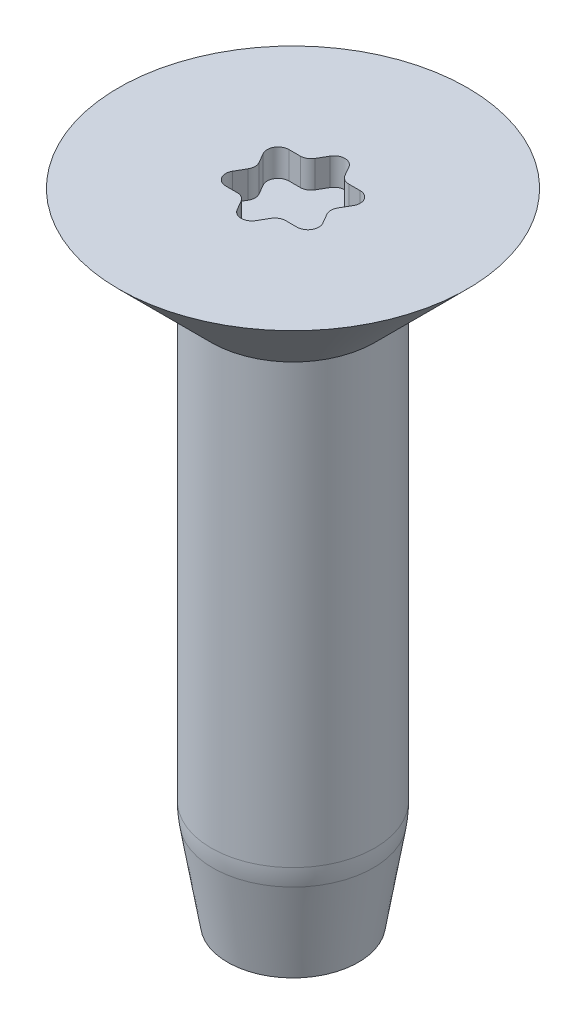
ISO-10303-21;
HEADER;
FILE_DESCRIPTION(('STEP AP214'),'2;1');
FILE_NAME('part.step','',(''),(''),'','','');
FILE_SCHEMA(('AUTOMOTIVE_DESIGN { 1 0 10303 214 1 1 1 1 }'));
ENDSEC;
DATA;
#1=APPLICATION_CONTEXT('core data for automotive mechanical design processes');
#2=APPLICATION_PROTOCOL_DEFINITION('international standard','automotive_design',2000,#1);
#3=PRODUCT_CONTEXT('',#1,'mechanical');
#4=PRODUCT('Part','Part','',(#3));
#5=PRODUCT_RELATED_PRODUCT_CATEGORY('part','',(#4));
#6=PRODUCT_DEFINITION_FORMATION('','',#4);
#7=PRODUCT_DEFINITION_CONTEXT('part definition',#1,'design');
#8=PRODUCT_DEFINITION('design','',#6,#7);
#9=PRODUCT_DEFINITION_SHAPE('','',#8);
#10=(LENGTH_UNIT() NAMED_UNIT(*) SI_UNIT(.MILLI.,.METRE.));
#11=(NAMED_UNIT(*) PLANE_ANGLE_UNIT() SI_UNIT($,.RADIAN.));
#12=(NAMED_UNIT(*) SI_UNIT($,.STERADIAN.) SOLID_ANGLE_UNIT());
#13=UNCERTAINTY_MEASURE_WITH_UNIT(LENGTH_MEASURE(1.E-05),#10,'distance_accuracy_value','');
#14=(GEOMETRIC_REPRESENTATION_CONTEXT(3) GLOBAL_UNCERTAINTY_ASSIGNED_CONTEXT((#13)) GLOBAL_UNIT_ASSIGNED_CONTEXT((#10,
#11,#12)) REPRESENTATION_CONTEXT('',''));
#15=CARTESIAN_POINT('',(0.,0.,0.));
#16=DIRECTION('',(0.,0.,1.));
#17=DIRECTION('',(1.,0.,0.));
#18=AXIS2_PLACEMENT_3D('',#15,#16,#17);
#19=CARTESIAN_POINT('',(0.,-10.,0.));
#20=DIRECTION('',(0.,1.,0.));
#21=DIRECTION('',(0.,0.,1.));
#22=AXIS2_PLACEMENT_3D('',#19,#20,#21);
#23=CYLINDRICAL_SURFACE('',#22,1.5);
#24=CARTESIAN_POINT('',(0.,-8.03447493940356,0.));
#25=DIRECTION('',(0.,-1.,0.));
#26=DIRECTION('',(1.,0.,0.));
#27=AXIS2_PLACEMENT_3D('',#24,#25,#26);
#28=CIRCLE('',#27,1.5);
#29=CARTESIAN_POINT('',(1.5,-8.03447493940356,0.));
#30=VERTEX_POINT('',#29);
#31=EDGE_CURVE('E44',#30,#30,#28,.F.);
#32=ORIENTED_EDGE('',*,*,#31,.T.);
#33=EDGE_LOOP('',(#32));
#34=FACE_BOUND('',#33,.T.);
#35=CARTESIAN_POINT('',(0.,0.,0.));
#36=DIRECTION('',(0.,-1.,0.));
#37=DIRECTION('',(0.,0.,-1.));
#38=AXIS2_PLACEMENT_3D('',#35,#36,#37);
#39=CIRCLE('',#38,1.5);
#40=CARTESIAN_POINT('',(0.,0.,-1.5));
#41=VERTEX_POINT('',#40);
#42=EDGE_CURVE('E239',#41,#41,#39,.T.);
#43=ORIENTED_EDGE('',*,*,#42,.T.);
#44=EDGE_LOOP('',(#43));
#45=FACE_BOUND('',#44,.T.);
#46=ADVANCED_FACE('F36',(#34,#45),#23,.T.);
#47=CARTESIAN_POINT('',(0.,1.7,0.));
#48=DIRECTION('',(0.,-1.,0.));
#49=DIRECTION('',(0.,0.,-1.));
#50=AXIS2_PLACEMENT_3D('',#47,#48,#49);
#51=PLANE('',#50);
#52=DIRECTION('',(0.5,0.,-0.866025403784439));
#53=VECTOR('',#52,1.);
#54=CARTESIAN_POINT('',(1.,1.7,-0.58));
#55=LINE('',#54,#53);
#56=CARTESIAN_POINT('',(0.72287187078898,1.7,-0.0999999999999997));
#57=VERTEX_POINT('',#56);
#58=CARTESIAN_POINT('',(0.826794919243113,1.7,-0.28));
#59=VERTEX_POINT('',#58);
#60=EDGE_CURVE('E227',#57,#59,#55,.T.);
#61=ORIENTED_EDGE('',*,*,#60,.F.);
#62=CARTESIAN_POINT('',(0.896076951545868,1.7,0.));
#63=DIRECTION('',(0.,-1.,0.));
#64=DIRECTION('',(0.,0.,-1.));
#65=AXIS2_PLACEMENT_3D('',#62,#63,#64);
#66=CIRCLE('',#65,0.2);
#67=CARTESIAN_POINT('',(0.72287187078898,1.7,0.1));
#68=VERTEX_POINT('',#67);
#69=EDGE_CURVE('E270',#57,#68,#66,.F.);
#70=ORIENTED_EDGE('',*,*,#69,.T.);
#71=DIRECTION('',(-0.5,0.,-0.866025403784439));
#72=VECTOR('',#71,1.);
#73=CARTESIAN_POINT('',(0.665136843870018,1.7,0.));
#74=LINE('',#73,#72);
#75=CARTESIAN_POINT('',(0.826794919243113,1.7,0.28));
#76=VERTEX_POINT('',#75);
#77=EDGE_CURVE('E232',#76,#68,#74,.T.);
#78=ORIENTED_EDGE('',*,*,#77,.F.);
#79=CARTESIAN_POINT('',(0.653589838486225,1.7,0.38));
#80=DIRECTION('',(0.,-1.,0.));
#81=DIRECTION('',(0.,0.,-1.));
#82=AXIS2_PLACEMENT_3D('',#79,#80,#81);
#83=CIRCLE('',#82,0.2);
#84=CARTESIAN_POINT('',(0.653589838486225,1.7,0.58));
#85=VERTEX_POINT('',#84);
#86=EDGE_CURVE('E321',#76,#85,#83,.T.);
#87=ORIENTED_EDGE('',*,*,#86,.T.);
#88=DIRECTION('',(1.,0.,0.));
#89=VECTOR('',#88,1.);
#90=CARTESIAN_POINT('',(0.330273687740034,1.7,0.58));
#91=LINE('',#90,#89);
#92=CARTESIAN_POINT('',(0.445743741577959,1.7,0.58));
#93=VERTEX_POINT('',#92);
#94=EDGE_CURVE('E474',#93,#85,#91,.T.);
#95=ORIENTED_EDGE('',*,*,#94,.F.);
#96=CARTESIAN_POINT('',(0.445743741577959,1.7,0.78));
#97=DIRECTION('',(0.,-1.,0.));
#98=DIRECTION('',(0.,0.,-1.));
#99=AXIS2_PLACEMENT_3D('',#96,#97,#98);
#100=CIRCLE('',#99,0.2);
#101=CARTESIAN_POINT('',(0.272538660821072,1.7,0.68));
#102=VERTEX_POINT('',#101);
#103=EDGE_CURVE('E268',#93,#102,#100,.F.);
#104=ORIENTED_EDGE('',*,*,#103,.T.);
#105=DIRECTION('',(0.499999999999999,0.,-0.866025403784439));
#106=VECTOR('',#105,1.);
#107=CARTESIAN_POINT('',(0.330273687740034,1.7,0.58));
#108=LINE('',#107,#106);
#109=CARTESIAN_POINT('',(0.173205080756888,1.7,0.852050807568877));
#110=VERTEX_POINT('',#109);
#111=EDGE_CURVE('E471',#110,#102,#108,.T.);
#112=ORIENTED_EDGE('',*,*,#111,.F.);
#113=CARTESIAN_POINT('',(0.,1.7,0.752050807568877));
#114=DIRECTION('',(0.,-1.,0.));
#115=DIRECTION('',(0.,0.,-1.));
#116=AXIS2_PLACEMENT_3D('',#113,#114,#115);
#117=CIRCLE('',#116,0.2);
#118=CARTESIAN_POINT('',(-0.173205080756887,1.7,0.852050807568877));
#119=VERTEX_POINT('',#118);
#120=EDGE_CURVE('E325',#110,#119,#117,.T.);
#121=ORIENTED_EDGE('',*,*,#120,.T.);
#122=DIRECTION('',(0.5,0.,0.866025403784439));
#123=VECTOR('',#122,1.);
#124=CARTESIAN_POINT('',(-0.330273687740034,1.7,0.58));
#125=LINE('',#124,#123);
#126=CARTESIAN_POINT('',(-0.272538660821071,1.7,0.68));
#127=VERTEX_POINT('',#126);
#128=EDGE_CURVE('E468',#127,#119,#125,.T.);
#129=ORIENTED_EDGE('',*,*,#128,.F.);
#130=CARTESIAN_POINT('',(-0.445743741577959,1.7,0.78));
#131=DIRECTION('',(0.,-1.,0.));
#132=DIRECTION('',(0.,0.,-1.));
#133=AXIS2_PLACEMENT_3D('',#130,#131,#132);
#134=CIRCLE('',#133,0.2);
#135=CARTESIAN_POINT('',(-0.445743741577959,1.7,0.58));
#136=VERTEX_POINT('',#135);
#137=EDGE_CURVE('E266',#127,#136,#134,.F.);
#138=ORIENTED_EDGE('',*,*,#137,.T.);
#139=DIRECTION('',(1.,0.,0.));
#140=VECTOR('',#139,1.);
#141=CARTESIAN_POINT('',(-1.,1.7,0.58));
#142=LINE('',#141,#140);
#143=CARTESIAN_POINT('',(-0.653589838486224,1.7,0.58));
#144=VERTEX_POINT('',#143);
#145=EDGE_CURVE('E465',#144,#136,#142,.T.);
#146=ORIENTED_EDGE('',*,*,#145,.F.);
#147=CARTESIAN_POINT('',(-0.653589838486224,1.7,0.38));
#148=DIRECTION('',(0.,-1.,0.));
#149=DIRECTION('',(0.,0.,-1.));
#150=AXIS2_PLACEMENT_3D('',#147,#148,#149);
#151=CIRCLE('',#150,0.2);
#152=CARTESIAN_POINT('',(-0.826794919243112,1.7,0.28));
#153=VERTEX_POINT('',#152);
#154=EDGE_CURVE('E329',#144,#153,#151,.T.);
#155=ORIENTED_EDGE('',*,*,#154,.T.);
#156=DIRECTION('',(-0.5,0.,0.866025403784439));
#157=VECTOR('',#156,1.);
#158=CARTESIAN_POINT('',(-0.665136843870017,1.7,0.));
#159=LINE('',#158,#157);
#160=CARTESIAN_POINT('',(-0.722871870788979,1.7,0.0999999999999998));
#161=VERTEX_POINT('',#160);
#162=EDGE_CURVE('E462',#161,#153,#159,.T.);
#163=ORIENTED_EDGE('',*,*,#162,.F.);
#164=CARTESIAN_POINT('',(-0.896076951545867,1.7,0.));
#165=DIRECTION('',(0.,-1.,0.));
#166=DIRECTION('',(0.,0.,-1.));
#167=AXIS2_PLACEMENT_3D('',#164,#165,#166);
#168=CIRCLE('',#167,0.2);
#169=CARTESIAN_POINT('',(-0.722871870788979,1.7,-0.1));
#170=VERTEX_POINT('',#169);
#171=EDGE_CURVE('E51',#161,#170,#168,.F.);
#172=ORIENTED_EDGE('',*,*,#171,.T.);
#173=DIRECTION('',(0.5,0.,0.866025403784439));
#174=VECTOR('',#173,1.);
#175=CARTESIAN_POINT('',(-0.999999999999999,1.7,-0.58));
#176=LINE('',#175,#174);
#177=CARTESIAN_POINT('',(-0.826794919243112,1.7,-0.28));
#178=VERTEX_POINT('',#177);
#179=EDGE_CURVE('E460',#178,#170,#176,.T.);
#180=ORIENTED_EDGE('',*,*,#179,.F.);
#181=CARTESIAN_POINT('',(-0.653589838486224,1.7,-0.38));
#182=DIRECTION('',(0.,-1.,0.));
#183=DIRECTION('',(0.,0.,-1.));
#184=AXIS2_PLACEMENT_3D('',#181,#182,#183);
#185=CIRCLE('',#184,0.2);
#186=CARTESIAN_POINT('',(-0.653589838486224,1.7,-0.58));
#187=VERTEX_POINT('',#186);
#188=EDGE_CURVE('E59',#178,#187,#185,.T.);
#189=ORIENTED_EDGE('',*,*,#188,.T.);
#190=DIRECTION('',(-1.,0.,0.));
#191=VECTOR('',#190,1.);
#192=CARTESIAN_POINT('',(-0.999999999999999,1.7,-0.58));
#193=LINE('',#192,#191);
#194=CARTESIAN_POINT('',(-0.44574374157796,1.7,-0.58));
#195=VERTEX_POINT('',#194);
#196=EDGE_CURVE('E457',#195,#187,#193,.T.);
#197=ORIENTED_EDGE('',*,*,#196,.F.);
#198=CARTESIAN_POINT('',(-0.445743741577959,1.7,-0.78));
#199=DIRECTION('',(0.,-1.,0.));
#200=DIRECTION('',(0.,0.,-1.));
#201=AXIS2_PLACEMENT_3D('',#198,#199,#200);
#202=CIRCLE('',#201,0.2);
#203=CARTESIAN_POINT('',(-0.272538660821072,1.7,-0.68));
#204=VERTEX_POINT('',#203);
#205=EDGE_CURVE('E262',#195,#204,#202,.F.);
#206=ORIENTED_EDGE('',*,*,#205,.T.);
#207=DIRECTION('',(-0.5,0.,0.866025403784439));
#208=VECTOR('',#207,1.);
#209=CARTESIAN_POINT('',(0.,1.7,-1.15205080756888));
#210=LINE('',#209,#208);
#211=CARTESIAN_POINT('',(-0.173205080756888,1.7,-0.852050807568877));
#212=VERTEX_POINT('',#211);
#213=EDGE_CURVE('E455',#212,#204,#210,.T.);
#214=ORIENTED_EDGE('',*,*,#213,.F.);
#215=CARTESIAN_POINT('',(0.,1.7,-0.752050807568877));
#216=DIRECTION('',(0.,-1.,0.));
#217=DIRECTION('',(0.,0.,-1.));
#218=AXIS2_PLACEMENT_3D('',#215,#216,#217);
#219=CIRCLE('',#218,0.2);
#220=CARTESIAN_POINT('',(0.173205080756888,1.7,-0.852050807568877));
#221=VERTEX_POINT('',#220);
#222=EDGE_CURVE('E336',#212,#221,#219,.T.);
#223=ORIENTED_EDGE('',*,*,#222,.T.);
#224=DIRECTION('',(-0.5,0.,-0.866025403784439));
#225=VECTOR('',#224,1.);
#226=CARTESIAN_POINT('',(0.,1.7,-1.15205080756888));
#227=LINE('',#226,#225);
#228=CARTESIAN_POINT('',(0.272538660821072,1.7,-0.68));
#229=VERTEX_POINT('',#228);
#230=EDGE_CURVE('E226',#229,#221,#227,.T.);
#231=ORIENTED_EDGE('',*,*,#230,.F.);
#232=CARTESIAN_POINT('',(0.445743741577959,1.7,-0.78));
#233=DIRECTION('',(0.,-1.,0.));
#234=DIRECTION('',(0.,0.,-1.));
#235=AXIS2_PLACEMENT_3D('',#232,#233,#234);
#236=CIRCLE('',#235,0.2);
#237=CARTESIAN_POINT('',(0.445743741577959,1.7,-0.58));
#238=VERTEX_POINT('',#237);
#239=EDGE_CURVE('E225',#229,#238,#236,.F.);
#240=ORIENTED_EDGE('',*,*,#239,.T.);
#241=DIRECTION('',(-1.,0.,0.));
#242=VECTOR('',#241,1.);
#243=CARTESIAN_POINT('',(0.330273687740034,1.7,-0.58));
#244=LINE('',#243,#242);
#245=CARTESIAN_POINT('',(0.653589838486225,1.7,-0.58));
#246=VERTEX_POINT('',#245);
#247=EDGE_CURVE('E215',#246,#238,#244,.T.);
#248=ORIENTED_EDGE('',*,*,#247,.F.);
#249=CARTESIAN_POINT('',(0.653589838486225,1.7,-0.38));
#250=DIRECTION('',(0.,-1.,0.));
#251=DIRECTION('',(0.,0.,-1.));
#252=AXIS2_PLACEMENT_3D('',#249,#250,#251);
#253=CIRCLE('',#252,0.2);
#254=EDGE_CURVE('E199',#246,#59,#253,.T.);
#255=ORIENTED_EDGE('',*,*,#254,.T.);
#256=EDGE_LOOP('',(#61,#70,#78,#87,#95,#104,#112,#121,#129,#138,#146,#155,#163,#172,#180,#189,
#197,#206,#214,#223,#231,#240,#248,#255));
#257=FACE_BOUND('',#256,.T.);
#258=CARTESIAN_POINT('',(0.,1.7,0.));
#259=DIRECTION('',(0.,1.,0.));
#260=DIRECTION('',(0.,0.,1.));
#261=AXIS2_PLACEMENT_3D('',#258,#259,#260);
#262=CIRCLE('',#261,3.19999999999998);
#263=CARTESIAN_POINT('',(0.,1.7,3.19999999999998));
#264=VERTEX_POINT('',#263);
#265=EDGE_CURVE('E243',#264,#264,#262,.T.);
#266=ORIENTED_EDGE('',*,*,#265,.T.);
#267=EDGE_LOOP('',(#266));
#268=FACE_BOUND('',#267,.T.);
#269=ADVANCED_FACE('F222',(#257,#268),#51,.F.);
#270=CARTESIAN_POINT('',(0.,0.,0.));
#271=DIRECTION('',(0.,1.,0.));
#272=DIRECTION('',(0.,0.,1.));
#273=AXIS2_PLACEMENT_3D('',#270,#271,#272);
#274=CONICAL_SURFACE('',#273,1.5,0.785398163397443);
#275=ORIENTED_EDGE('',*,*,#265,.F.);
#276=EDGE_LOOP('',(#275));
#277=FACE_BOUND('',#276,.T.);
#278=ORIENTED_EDGE('',*,*,#42,.F.);
#279=EDGE_LOOP('',(#278));
#280=FACE_BOUND('',#279,.T.);
#281=ADVANCED_FACE('F358',(#277,#280),#274,.T.);
#282=CARTESIAN_POINT('',(0.,-8.2,0.));
#283=DIRECTION('',(0.,1.,0.));
#284=DIRECTION('',(-1.,0.,0.));
#285=AXIS2_PLACEMENT_3D('',#282,#283,#284);
#286=CONICAL_SURFACE('',#285,1.5,0.165148677414627);
#287=CARTESIAN_POINT('',(0.,-8.36327291401428,0.));
#288=DIRECTION('',(0.,1.,0.));
#289=DIRECTION('',(-1.,0.,0.));
#290=AXIS2_PLACEMENT_3D('',#287,#288,#289);
#291=CIRCLE('',#290,1.47278784766429);
#292=CARTESIAN_POINT('',(-1.47278784766429,-8.36327291401428,0.));
#293=VERTEX_POINT('',#292);
#294=EDGE_CURVE('E11',#293,#293,#291,.F.);
#295=ORIENTED_EDGE('',*,*,#294,.T.);
#296=EDGE_LOOP('',(#295));
#297=FACE_BOUND('',#296,.T.);
#298=CARTESIAN_POINT('',(0.,-10.,0.));
#299=DIRECTION('',(0.,1.,0.));
#300=DIRECTION('',(-1.,0.,0.));
#301=AXIS2_PLACEMENT_3D('',#298,#299,#300);
#302=CIRCLE('',#301,1.2);
#303=CARTESIAN_POINT('',(-1.2,-10.,0.));
#304=VERTEX_POINT('',#303);
#305=EDGE_CURVE('E236',#304,#304,#302,.T.);
#306=ORIENTED_EDGE('',*,*,#305,.T.);
#307=EDGE_LOOP('',(#306));
#308=FACE_BOUND('',#307,.T.);
#309=ADVANCED_FACE('F365',(#297,#308),#286,.T.);
#310=CARTESIAN_POINT('',(0.,-10.,0.));
#311=DIRECTION('',(0.,-1.,0.));
#312=DIRECTION('',(0.,0.,-1.));
#313=AXIS2_PLACEMENT_3D('',#310,#311,#312);
#314=PLANE('',#313);
#315=ORIENTED_EDGE('',*,*,#305,.F.);
#316=EDGE_LOOP('',(#315));
#317=FACE_BOUND('',#316,.T.);
#318=ADVANCED_FACE('F362',(#317),#314,.T.);
#319=CARTESIAN_POINT('',(0.,1.2,-1.15205080756888));
#320=DIRECTION('',(-0.866025403784439,0.,-0.5));
#321=DIRECTION('',(-0.5,0.,0.866025403784439));
#322=AXIS2_PLACEMENT_3D('',#319,#320,#321);
#323=PLANE('',#322);
#324=DIRECTION('',(-0.5,0.,0.866025403784439));
#325=VECTOR('',#324,1.);
#326=CARTESIAN_POINT('',(0.,1.2,-1.15205080756888));
#327=LINE('',#326,#325);
#328=CARTESIAN_POINT('',(-0.173205080756888,1.2,-0.852050807568877));
#329=VERTEX_POINT('',#328);
#330=CARTESIAN_POINT('',(-0.272538660821072,1.2,-0.68));
#331=VERTEX_POINT('',#330);
#332=EDGE_CURVE('E230',#329,#331,#327,.T.);
#333=ORIENTED_EDGE('',*,*,#332,.F.);
#334=DIRECTION('',(0.,1.,0.));
#335=VECTOR('',#334,1.);
#336=CARTESIAN_POINT('',(-0.173205080756888,1.7,-0.852050807568877));
#337=LINE('',#336,#335);
#338=EDGE_CURVE('E209',#329,#212,#337,.T.);
#339=ORIENTED_EDGE('',*,*,#338,.T.);
#340=ORIENTED_EDGE('',*,*,#213,.T.);
#341=DIRECTION('',(0.,1.,0.));
#342=VECTOR('',#341,1.);
#343=CARTESIAN_POINT('',(-0.272538660821072,1.2,-0.68));
#344=LINE('',#343,#342);
#345=EDGE_CURVE('E316',#204,#331,#344,.F.);
#346=ORIENTED_EDGE('',*,*,#345,.T.);
#347=EDGE_LOOP('',(#333,#339,#340,#346));
#348=FACE_BOUND('',#347,.T.);
#349=ADVANCED_FACE('F421',(#348),#323,.F.);
#350=CARTESIAN_POINT('',(0.,1.2,-1.15205080756888));
#351=DIRECTION('',(0.866025403784439,0.,-0.5));
#352=DIRECTION('',(-0.5,0.,-0.866025403784439));
#353=AXIS2_PLACEMENT_3D('',#350,#351,#352);
#354=PLANE('',#353);
#355=DIRECTION('',(-0.5,0.,-0.866025403784439));
#356=VECTOR('',#355,1.);
#357=CARTESIAN_POINT('',(0.,1.2,-1.15205080756888));
#358=LINE('',#357,#356);
#359=CARTESIAN_POINT('',(0.272538660821072,1.2,-0.68));
#360=VERTEX_POINT('',#359);
#361=CARTESIAN_POINT('',(0.173205080756888,1.2,-0.852050807568877));
#362=VERTEX_POINT('',#361);
#363=EDGE_CURVE('E240',#360,#362,#358,.T.);
#364=ORIENTED_EDGE('',*,*,#363,.F.);
#365=DIRECTION('',(0.,1.,0.));
#366=VECTOR('',#365,1.);
#367=CARTESIAN_POINT('',(0.272538660821072,1.2,-0.68));
#368=LINE('',#367,#366);
#369=EDGE_CURVE('E313',#360,#229,#368,.T.);
#370=ORIENTED_EDGE('',*,*,#369,.T.);
#371=ORIENTED_EDGE('',*,*,#230,.T.);
#372=DIRECTION('',(0.,1.,0.));
#373=VECTOR('',#372,1.);
#374=CARTESIAN_POINT('',(0.173205080756888,1.2,-0.852050807568877));
#375=LINE('',#374,#373);
#376=EDGE_CURVE('E311',#221,#362,#375,.F.);
#377=ORIENTED_EDGE('',*,*,#376,.T.);
#378=EDGE_LOOP('',(#364,#370,#371,#377));
#379=FACE_BOUND('',#378,.T.);
#380=ADVANCED_FACE('F496',(#379),#354,.F.);
#381=CARTESIAN_POINT('',(0.330273687740034,1.2,-0.58));
#382=DIRECTION('',(0.,0.,-1.));
#383=DIRECTION('',(-1.,0.,0.));
#384=AXIS2_PLACEMENT_3D('',#381,#382,#383);
#385=PLANE('',#384);
#386=DIRECTION('',(-1.,0.,0.));
#387=VECTOR('',#386,1.);
#388=CARTESIAN_POINT('',(0.330273687740034,1.2,-0.58));
#389=LINE('',#388,#387);
#390=CARTESIAN_POINT('',(0.653589838486225,1.2,-0.58));
#391=VERTEX_POINT('',#390);
#392=CARTESIAN_POINT('',(0.445743741577959,1.2,-0.58));
#393=VERTEX_POINT('',#392);
#394=EDGE_CURVE('E218',#391,#393,#389,.T.);
#395=ORIENTED_EDGE('',*,*,#394,.F.);
#396=DIRECTION('',(0.,1.,0.));
#397=VECTOR('',#396,1.);
#398=CARTESIAN_POINT('',(0.653589838486225,1.7,-0.58));
#399=LINE('',#398,#397);
#400=EDGE_CURVE('E203',#391,#246,#399,.T.);
#401=ORIENTED_EDGE('',*,*,#400,.T.);
#402=ORIENTED_EDGE('',*,*,#247,.T.);
#403=DIRECTION('',(0.,1.,0.));
#404=VECTOR('',#403,1.);
#405=CARTESIAN_POINT('',(0.445743741577959,1.2,-0.58));
#406=LINE('',#405,#404);
#407=EDGE_CURVE('E220',#238,#393,#406,.F.);
#408=ORIENTED_EDGE('',*,*,#407,.T.);
#409=EDGE_LOOP('',(#395,#401,#402,#408));
#410=FACE_BOUND('',#409,.T.);
#411=ADVANCED_FACE('F214',(#410),#385,.F.);
#412=CARTESIAN_POINT('',(1.,1.2,-0.58));
#413=DIRECTION('',(0.866025403784439,0.,0.5));
#414=DIRECTION('',(0.5,0.,-0.866025403784439));
#415=AXIS2_PLACEMENT_3D('',#412,#413,#414);
#416=PLANE('',#415);
#417=ORIENTED_EDGE('',*,*,#60,.T.);
#418=DIRECTION('',(0.,1.,0.));
#419=VECTOR('',#418,1.);
#420=CARTESIAN_POINT('',(0.826794919243113,1.2,-0.28));
#421=LINE('',#420,#419);
#422=CARTESIAN_POINT('',(0.826794919243113,1.2,-0.28));
#423=VERTEX_POINT('',#422);
#424=EDGE_CURVE('E204',#59,#423,#421,.F.);
#425=ORIENTED_EDGE('',*,*,#424,.T.);
#426=DIRECTION('',(0.5,0.,-0.866025403784439));
#427=VECTOR('',#426,1.);
#428=CARTESIAN_POINT('',(1.,1.2,-0.58));
#429=LINE('',#428,#427);
#430=CARTESIAN_POINT('',(0.72287187078898,1.2,-0.0999999999999997));
#431=VERTEX_POINT('',#430);
#432=EDGE_CURVE('E451',#431,#423,#429,.T.);
#433=ORIENTED_EDGE('',*,*,#432,.F.);
#434=DIRECTION('',(0.,1.,0.));
#435=VECTOR('',#434,1.);
#436=CARTESIAN_POINT('',(0.72287187078898,1.2,-0.0999999999999998));
#437=LINE('',#436,#435);
#438=EDGE_CURVE('E219',#431,#57,#437,.T.);
#439=ORIENTED_EDGE('',*,*,#438,.T.);
#440=EDGE_LOOP('',(#417,#425,#433,#439));
#441=FACE_BOUND('',#440,.T.);
#442=ADVANCED_FACE('F487',(#441),#416,.F.);
#443=CARTESIAN_POINT('',(0.665136843870018,1.2,0.));
#444=DIRECTION('',(0.866025403784439,0.,-0.5));
#445=DIRECTION('',(-0.5,0.,-0.866025403784439));
#446=AXIS2_PLACEMENT_3D('',#443,#444,#445);
#447=PLANE('',#446);
#448=ORIENTED_EDGE('',*,*,#77,.T.);
#449=DIRECTION('',(0.,1.,0.));
#450=VECTOR('',#449,1.);
#451=CARTESIAN_POINT('',(0.72287187078898,1.2,0.1));
#452=LINE('',#451,#450);
#453=CARTESIAN_POINT('',(0.72287187078898,1.2,0.1));
#454=VERTEX_POINT('',#453);
#455=EDGE_CURVE('E275',#68,#454,#452,.F.);
#456=ORIENTED_EDGE('',*,*,#455,.T.);
#457=DIRECTION('',(-0.5,0.,-0.866025403784439));
#458=VECTOR('',#457,1.);
#459=CARTESIAN_POINT('',(0.665136843870018,1.2,0.));
#460=LINE('',#459,#458);
#461=CARTESIAN_POINT('',(0.826794919243113,1.2,0.28));
#462=VERTEX_POINT('',#461);
#463=EDGE_CURVE('E448',#462,#454,#460,.T.);
#464=ORIENTED_EDGE('',*,*,#463,.F.);
#465=DIRECTION('',(0.,1.,0.));
#466=VECTOR('',#465,1.);
#467=CARTESIAN_POINT('',(0.826794919243113,1.7,0.28));
#468=LINE('',#467,#466);
#469=EDGE_CURVE('E272',#462,#76,#468,.T.);
#470=ORIENTED_EDGE('',*,*,#469,.T.);
#471=EDGE_LOOP('',(#448,#456,#464,#470));
#472=FACE_BOUND('',#471,.T.);
#473=ADVANCED_FACE('F480',(#472),#447,.F.);
#474=CARTESIAN_POINT('',(0.330273687740034,1.2,0.58));
#475=DIRECTION('',(0.,0.,1.));
#476=DIRECTION('',(1.,0.,0.));
#477=AXIS2_PLACEMENT_3D('',#474,#475,#476);
#478=PLANE('',#477);
#479=ORIENTED_EDGE('',*,*,#94,.T.);
#480=DIRECTION('',(0.,1.,0.));
#481=VECTOR('',#480,1.);
#482=CARTESIAN_POINT('',(0.653589838486225,1.2,0.58));
#483=LINE('',#482,#481);
#484=CARTESIAN_POINT('',(0.653589838486225,1.2,0.58));
#485=VERTEX_POINT('',#484);
#486=EDGE_CURVE('E280',#85,#485,#483,.F.);
#487=ORIENTED_EDGE('',*,*,#486,.T.);
#488=DIRECTION('',(1.,0.,0.));
#489=VECTOR('',#488,1.);
#490=CARTESIAN_POINT('',(0.330273687740034,1.2,0.58));
#491=LINE('',#490,#489);
#492=CARTESIAN_POINT('',(0.445743741577959,1.2,0.58));
#493=VERTEX_POINT('',#492);
#494=EDGE_CURVE('E445',#493,#485,#491,.T.);
#495=ORIENTED_EDGE('',*,*,#494,.F.);
#496=DIRECTION('',(0.,1.,0.));
#497=VECTOR('',#496,1.);
#498=CARTESIAN_POINT('',(0.445743741577959,1.2,0.58));
#499=LINE('',#498,#497);
#500=EDGE_CURVE('E277',#493,#93,#499,.T.);
#501=ORIENTED_EDGE('',*,*,#500,.T.);
#502=EDGE_LOOP('',(#479,#487,#495,#501));
#503=FACE_BOUND('',#502,.T.);
#504=ADVANCED_FACE('F494',(#503),#478,.F.);
#505=CARTESIAN_POINT('',(0.330273687740034,1.2,0.58));
#506=DIRECTION('',(0.866025403784439,0.,0.499999999999999));
#507=DIRECTION('',(0.499999999999999,0.,-0.866025403784439));
#508=AXIS2_PLACEMENT_3D('',#505,#506,#507);
#509=PLANE('',#508);
#510=ORIENTED_EDGE('',*,*,#111,.T.);
#511=DIRECTION('',(0.,1.,0.));
#512=VECTOR('',#511,1.);
#513=CARTESIAN_POINT('',(0.272538660821072,1.2,0.68));
#514=LINE('',#513,#512);
#515=CARTESIAN_POINT('',(0.272538660821072,1.2,0.68));
#516=VERTEX_POINT('',#515);
#517=EDGE_CURVE('E285',#102,#516,#514,.F.);
#518=ORIENTED_EDGE('',*,*,#517,.T.);
#519=DIRECTION('',(0.499999999999999,0.,-0.866025403784439));
#520=VECTOR('',#519,1.);
#521=CARTESIAN_POINT('',(0.330273687740034,1.2,0.58));
#522=LINE('',#521,#520);
#523=CARTESIAN_POINT('',(0.173205080756888,1.2,0.852050807568877));
#524=VERTEX_POINT('',#523);
#525=EDGE_CURVE('E442',#524,#516,#522,.T.);
#526=ORIENTED_EDGE('',*,*,#525,.F.);
#527=DIRECTION('',(0.,1.,0.));
#528=VECTOR('',#527,1.);
#529=CARTESIAN_POINT('',(0.173205080756888,1.7,0.852050807568877));
#530=LINE('',#529,#528);
#531=EDGE_CURVE('E282',#524,#110,#530,.T.);
#532=ORIENTED_EDGE('',*,*,#531,.T.);
#533=EDGE_LOOP('',(#510,#518,#526,#532));
#534=FACE_BOUND('',#533,.T.);
#535=ADVANCED_FACE('F502',(#534),#509,.F.);
#536=CARTESIAN_POINT('',(-0.330273687740034,1.2,0.58));
#537=DIRECTION('',(-0.866025403784439,0.,0.5));
#538=DIRECTION('',(0.5,0.,0.866025403784439));
#539=AXIS2_PLACEMENT_3D('',#536,#537,#538);
#540=PLANE('',#539);
#541=ORIENTED_EDGE('',*,*,#128,.T.);
#542=DIRECTION('',(0.,1.,0.));
#543=VECTOR('',#542,1.);
#544=CARTESIAN_POINT('',(-0.173205080756887,1.2,0.852050807568877));
#545=LINE('',#544,#543);
#546=CARTESIAN_POINT('',(-0.173205080756887,1.2,0.852050807568877));
#547=VERTEX_POINT('',#546);
#548=EDGE_CURVE('E290',#119,#547,#545,.F.);
#549=ORIENTED_EDGE('',*,*,#548,.T.);
#550=DIRECTION('',(0.5,0.,0.866025403784439));
#551=VECTOR('',#550,1.);
#552=CARTESIAN_POINT('',(-0.330273687740034,1.2,0.58));
#553=LINE('',#552,#551);
#554=CARTESIAN_POINT('',(-0.272538660821071,1.2,0.68));
#555=VERTEX_POINT('',#554);
#556=EDGE_CURVE('E439',#555,#547,#553,.T.);
#557=ORIENTED_EDGE('',*,*,#556,.F.);
#558=DIRECTION('',(0.,1.,0.));
#559=VECTOR('',#558,1.);
#560=CARTESIAN_POINT('',(-0.272538660821071,1.2,0.68));
#561=LINE('',#560,#559);
#562=EDGE_CURVE('E287',#555,#127,#561,.T.);
#563=ORIENTED_EDGE('',*,*,#562,.T.);
#564=EDGE_LOOP('',(#541,#549,#557,#563));
#565=FACE_BOUND('',#564,.T.);
#566=ADVANCED_FACE('F506',(#565),#540,.F.);
#567=CARTESIAN_POINT('',(-1.,1.2,0.58));
#568=DIRECTION('',(0.,0.,1.));
#569=DIRECTION('',(1.,0.,0.));
#570=AXIS2_PLACEMENT_3D('',#567,#568,#569);
#571=PLANE('',#570);
#572=ORIENTED_EDGE('',*,*,#145,.T.);
#573=DIRECTION('',(0.,1.,0.));
#574=VECTOR('',#573,1.);
#575=CARTESIAN_POINT('',(-0.445743741577959,1.2,0.58));
#576=LINE('',#575,#574);
#577=CARTESIAN_POINT('',(-0.445743741577959,1.2,0.58));
#578=VERTEX_POINT('',#577);
#579=EDGE_CURVE('E295',#136,#578,#576,.F.);
#580=ORIENTED_EDGE('',*,*,#579,.T.);
#581=DIRECTION('',(1.,0.,0.));
#582=VECTOR('',#581,1.);
#583=CARTESIAN_POINT('',(-1.,1.2,0.58));
#584=LINE('',#583,#582);
#585=CARTESIAN_POINT('',(-0.653589838486224,1.2,0.58));
#586=VERTEX_POINT('',#585);
#587=EDGE_CURVE('E436',#586,#578,#584,.T.);
#588=ORIENTED_EDGE('',*,*,#587,.F.);
#589=DIRECTION('',(0.,1.,0.));
#590=VECTOR('',#589,1.);
#591=CARTESIAN_POINT('',(-0.653589838486224,1.7,0.58));
#592=LINE('',#591,#590);
#593=EDGE_CURVE('E292',#586,#144,#592,.T.);
#594=ORIENTED_EDGE('',*,*,#593,.T.);
#595=EDGE_LOOP('',(#572,#580,#588,#594));
#596=FACE_BOUND('',#595,.T.);
#597=ADVANCED_FACE('F510',(#596),#571,.F.);
#598=CARTESIAN_POINT('',(-0.665136843870017,1.2,0.));
#599=DIRECTION('',(-0.866025403784439,0.,-0.5));
#600=DIRECTION('',(-0.5,0.,0.866025403784439));
#601=AXIS2_PLACEMENT_3D('',#598,#599,#600);
#602=PLANE('',#601);
#603=ORIENTED_EDGE('',*,*,#162,.T.);
#604=DIRECTION('',(0.,1.,0.));
#605=VECTOR('',#604,1.);
#606=CARTESIAN_POINT('',(-0.826794919243112,1.2,0.28));
#607=LINE('',#606,#605);
#608=CARTESIAN_POINT('',(-0.826794919243112,1.2,0.28));
#609=VERTEX_POINT('',#608);
#610=EDGE_CURVE('E300',#153,#609,#607,.F.);
#611=ORIENTED_EDGE('',*,*,#610,.T.);
#612=DIRECTION('',(-0.5,0.,0.866025403784439));
#613=VECTOR('',#612,1.);
#614=CARTESIAN_POINT('',(-0.665136843870017,1.2,0.));
#615=LINE('',#614,#613);
#616=CARTESIAN_POINT('',(-0.722871870788979,1.2,0.0999999999999998));
#617=VERTEX_POINT('',#616);
#618=EDGE_CURVE('E433',#617,#609,#615,.T.);
#619=ORIENTED_EDGE('',*,*,#618,.F.);
#620=DIRECTION('',(0.,1.,0.));
#621=VECTOR('',#620,1.);
#622=CARTESIAN_POINT('',(-0.722871870788979,1.2,0.0999999999999998));
#623=LINE('',#622,#621);
#624=EDGE_CURVE('E297',#617,#161,#623,.T.);
#625=ORIENTED_EDGE('',*,*,#624,.T.);
#626=EDGE_LOOP('',(#603,#611,#619,#625));
#627=FACE_BOUND('',#626,.T.);
#628=ADVANCED_FACE('F514',(#627),#602,.F.);
#629=CARTESIAN_POINT('',(-0.999999999999999,1.2,-0.58));
#630=DIRECTION('',(-0.866025403784439,0.,0.5));
#631=DIRECTION('',(0.5,0.,0.866025403784439));
#632=AXIS2_PLACEMENT_3D('',#629,#630,#631);
#633=PLANE('',#632);
#634=ORIENTED_EDGE('',*,*,#179,.T.);
#635=DIRECTION('',(0.,1.,0.));
#636=VECTOR('',#635,1.);
#637=CARTESIAN_POINT('',(-0.722871870788979,1.2,-0.1));
#638=LINE('',#637,#636);
#639=CARTESIAN_POINT('',(-0.722871870788979,1.2,-0.1));
#640=VERTEX_POINT('',#639);
#641=EDGE_CURVE('E304',#170,#640,#638,.F.);
#642=ORIENTED_EDGE('',*,*,#641,.T.);
#643=DIRECTION('',(0.5,0.,0.866025403784439));
#644=VECTOR('',#643,1.);
#645=CARTESIAN_POINT('',(-0.999999999999999,1.2,-0.58));
#646=LINE('',#645,#644);
#647=CARTESIAN_POINT('',(-0.826794919243112,1.2,-0.28));
#648=VERTEX_POINT('',#647);
#649=EDGE_CURVE('E428',#648,#640,#646,.T.);
#650=ORIENTED_EDGE('',*,*,#649,.F.);
#651=DIRECTION('',(0.,1.,0.));
#652=VECTOR('',#651,1.);
#653=CARTESIAN_POINT('',(-0.826794919243112,1.7,-0.28));
#654=LINE('',#653,#652);
#655=EDGE_CURVE('E302',#648,#178,#654,.T.);
#656=ORIENTED_EDGE('',*,*,#655,.T.);
#657=EDGE_LOOP('',(#634,#642,#650,#656));
#658=FACE_BOUND('',#657,.T.);
#659=ADVANCED_FACE('F518',(#658),#633,.F.);
#660=CARTESIAN_POINT('',(-0.999999999999999,1.2,-0.58));
#661=DIRECTION('',(0.,0.,-1.));
#662=DIRECTION('',(-1.,0.,0.));
#663=AXIS2_PLACEMENT_3D('',#660,#661,#662);
#664=PLANE('',#663);
#665=ORIENTED_EDGE('',*,*,#196,.T.);
#666=DIRECTION('',(0.,1.,0.));
#667=VECTOR('',#666,1.);
#668=CARTESIAN_POINT('',(-0.653589838486224,1.2,-0.58));
#669=LINE('',#668,#667);
#670=CARTESIAN_POINT('',(-0.653589838486224,1.2,-0.58));
#671=VERTEX_POINT('',#670);
#672=EDGE_CURVE('E309',#187,#671,#669,.F.);
#673=ORIENTED_EDGE('',*,*,#672,.T.);
#674=DIRECTION('',(-1.,0.,0.));
#675=VECTOR('',#674,1.);
#676=CARTESIAN_POINT('',(-0.999999999999999,1.2,-0.58));
#677=LINE('',#676,#675);
#678=CARTESIAN_POINT('',(-0.44574374157796,1.2,-0.58));
#679=VERTEX_POINT('',#678);
#680=EDGE_CURVE('E425',#679,#671,#677,.T.);
#681=ORIENTED_EDGE('',*,*,#680,.F.);
#682=DIRECTION('',(0.,1.,0.));
#683=VECTOR('',#682,1.);
#684=CARTESIAN_POINT('',(-0.44574374157796,1.2,-0.58));
#685=LINE('',#684,#683);
#686=EDGE_CURVE('E306',#679,#195,#685,.T.);
#687=ORIENTED_EDGE('',*,*,#686,.T.);
#688=EDGE_LOOP('',(#665,#673,#681,#687));
#689=FACE_BOUND('',#688,.T.);
#690=ADVANCED_FACE('F522',(#689),#664,.F.);
#691=CARTESIAN_POINT('',(0.,1.2,0.));
#692=DIRECTION('',(0.,1.,0.));
#693=DIRECTION('',(0.,0.,1.));
#694=AXIS2_PLACEMENT_3D('',#691,#692,#693);
#695=PLANE('',#694);
#696=ORIENTED_EDGE('',*,*,#432,.T.);
#697=CARTESIAN_POINT('',(0.653589838486225,1.2,-0.38));
#698=DIRECTION('',(0.,1.,0.));
#699=DIRECTION('',(0.,0.,1.));
#700=AXIS2_PLACEMENT_3D('',#697,#698,#699);
#701=CIRCLE('',#700,0.2);
#702=EDGE_CURVE('E260',#423,#391,#701,.T.);
#703=ORIENTED_EDGE('',*,*,#702,.T.);
#704=ORIENTED_EDGE('',*,*,#394,.T.);
#705=CARTESIAN_POINT('',(0.445743741577959,1.2,-0.78));
#706=DIRECTION('',(0.,1.,0.));
#707=DIRECTION('',(0.,0.,1.));
#708=AXIS2_PLACEMENT_3D('',#705,#706,#707);
#709=CIRCLE('',#708,0.2);
#710=EDGE_CURVE('E334',#393,#360,#709,.F.);
#711=ORIENTED_EDGE('',*,*,#710,.T.);
#712=ORIENTED_EDGE('',*,*,#363,.T.);
#713=CARTESIAN_POINT('',(0.,1.2,-0.752050807568877));
#714=DIRECTION('',(0.,1.,0.));
#715=DIRECTION('',(0.,0.,1.));
#716=AXIS2_PLACEMENT_3D('',#713,#714,#715);
#717=CIRCLE('',#716,0.2);
#718=EDGE_CURVE('E250',#362,#329,#717,.T.);
#719=ORIENTED_EDGE('',*,*,#718,.T.);
#720=ORIENTED_EDGE('',*,*,#332,.T.);
#721=CARTESIAN_POINT('',(-0.445743741577959,1.2,-0.78));
#722=DIRECTION('',(0.,1.,0.));
#723=DIRECTION('',(0.,0.,1.));
#724=AXIS2_PLACEMENT_3D('',#721,#722,#723);
#725=CIRCLE('',#724,0.2);
#726=EDGE_CURVE('E338',#331,#679,#725,.F.);
#727=ORIENTED_EDGE('',*,*,#726,.T.);
#728=ORIENTED_EDGE('',*,*,#680,.T.);
#729=CARTESIAN_POINT('',(-0.653589838486224,1.2,-0.38));
#730=DIRECTION('',(0.,1.,0.));
#731=DIRECTION('',(0.,0.,1.));
#732=AXIS2_PLACEMENT_3D('',#729,#730,#731);
#733=CIRCLE('',#732,0.2);
#734=EDGE_CURVE('E252',#671,#648,#733,.T.);
#735=ORIENTED_EDGE('',*,*,#734,.T.);
#736=ORIENTED_EDGE('',*,*,#649,.T.);
#737=CARTESIAN_POINT('',(-0.896076951545867,1.2,0.));
#738=DIRECTION('',(0.,1.,0.));
#739=DIRECTION('',(0.,0.,1.));
#740=AXIS2_PLACEMENT_3D('',#737,#738,#739);
#741=CIRCLE('',#740,0.2);
#742=EDGE_CURVE('E331',#640,#617,#741,.F.);
#743=ORIENTED_EDGE('',*,*,#742,.T.);
#744=ORIENTED_EDGE('',*,*,#618,.T.);
#745=CARTESIAN_POINT('',(-0.653589838486224,1.2,0.38));
#746=DIRECTION('',(0.,1.,0.));
#747=DIRECTION('',(0.,0.,1.));
#748=AXIS2_PLACEMENT_3D('',#745,#746,#747);
#749=CIRCLE('',#748,0.2);
#750=EDGE_CURVE('E254',#609,#586,#749,.T.);
#751=ORIENTED_EDGE('',*,*,#750,.T.);
#752=ORIENTED_EDGE('',*,*,#587,.T.);
#753=CARTESIAN_POINT('',(-0.445743741577959,1.2,0.78));
#754=DIRECTION('',(0.,1.,0.));
#755=DIRECTION('',(0.,0.,1.));
#756=AXIS2_PLACEMENT_3D('',#753,#754,#755);
#757=CIRCLE('',#756,0.2);
#758=EDGE_CURVE('E327',#578,#555,#757,.F.);
#759=ORIENTED_EDGE('',*,*,#758,.T.);
#760=ORIENTED_EDGE('',*,*,#556,.T.);
#761=CARTESIAN_POINT('',(0.,1.2,0.752050807568877));
#762=DIRECTION('',(0.,1.,0.));
#763=DIRECTION('',(0.,0.,1.));
#764=AXIS2_PLACEMENT_3D('',#761,#762,#763);
#765=CIRCLE('',#764,0.2);
#766=EDGE_CURVE('E256',#547,#524,#765,.T.);
#767=ORIENTED_EDGE('',*,*,#766,.T.);
#768=ORIENTED_EDGE('',*,*,#525,.T.);
#769=CARTESIAN_POINT('',(0.445743741577959,1.2,0.78));
#770=DIRECTION('',(0.,1.,0.));
#771=DIRECTION('',(0.,0.,1.));
#772=AXIS2_PLACEMENT_3D('',#769,#770,#771);
#773=CIRCLE('',#772,0.2);
#774=EDGE_CURVE('E323',#516,#493,#773,.F.);
#775=ORIENTED_EDGE('',*,*,#774,.T.);
#776=ORIENTED_EDGE('',*,*,#494,.T.);
#777=CARTESIAN_POINT('',(0.653589838486225,1.2,0.38));
#778=DIRECTION('',(0.,1.,0.));
#779=DIRECTION('',(0.,0.,1.));
#780=AXIS2_PLACEMENT_3D('',#777,#778,#779);
#781=CIRCLE('',#780,0.2);
#782=EDGE_CURVE('E258',#485,#462,#781,.T.);
#783=ORIENTED_EDGE('',*,*,#782,.T.);
#784=ORIENTED_EDGE('',*,*,#463,.T.);
#785=CARTESIAN_POINT('',(0.896076951545868,1.2,0.));
#786=DIRECTION('',(0.,1.,0.));
#787=DIRECTION('',(0.,0.,1.));
#788=AXIS2_PLACEMENT_3D('',#785,#786,#787);
#789=CIRCLE('',#788,0.2);
#790=EDGE_CURVE('E208',#454,#431,#789,.F.);
#791=ORIENTED_EDGE('',*,*,#790,.T.);
#792=EDGE_LOOP('',(#696,#703,#704,#711,#712,#719,#720,#727,#728,#735,#736,#743,#744,#751,#752,
#759,#760,#767,#768,#775,#776,#783,#784,#791));
#793=FACE_BOUND('',#792,.T.);
#794=ADVANCED_FACE('F371',(#793),#695,.T.);
#795=CARTESIAN_POINT('',(0.653589838486225,1.2,-0.38));
#796=DIRECTION('',(0.,-1.,0.));
#797=DIRECTION('',(0.,0.,-1.));
#798=AXIS2_PLACEMENT_3D('',#795,#796,#797);
#799=CYLINDRICAL_SURFACE('',#798,0.2);
#800=ORIENTED_EDGE('',*,*,#702,.F.);
#801=ORIENTED_EDGE('',*,*,#424,.F.);
#802=ORIENTED_EDGE('',*,*,#254,.F.);
#803=ORIENTED_EDGE('',*,*,#400,.F.);
#804=EDGE_LOOP('',(#800,#801,#802,#803));
#805=FACE_BOUND('',#804,.T.);
#806=ADVANCED_FACE('F202',(#805),#799,.F.);
#807=CARTESIAN_POINT('',(0.896076951545868,1.2,0.));
#808=DIRECTION('',(0.,1.,0.));
#809=DIRECTION('',(0.,0.,1.));
#810=AXIS2_PLACEMENT_3D('',#807,#808,#809);
#811=CYLINDRICAL_SURFACE('',#810,0.2);
#812=ORIENTED_EDGE('',*,*,#790,.F.);
#813=ORIENTED_EDGE('',*,*,#455,.F.);
#814=ORIENTED_EDGE('',*,*,#69,.F.);
#815=ORIENTED_EDGE('',*,*,#438,.F.);
#816=EDGE_LOOP('',(#812,#813,#814,#815));
#817=FACE_BOUND('',#816,.T.);
#818=ADVANCED_FACE('F370',(#817),#811,.T.);
#819=CARTESIAN_POINT('',(0.653589838486225,1.2,0.38));
#820=DIRECTION('',(0.,-1.,0.));
#821=DIRECTION('',(0.,0.,-1.));
#822=AXIS2_PLACEMENT_3D('',#819,#820,#821);
#823=CYLINDRICAL_SURFACE('',#822,0.2);
#824=ORIENTED_EDGE('',*,*,#782,.F.);
#825=ORIENTED_EDGE('',*,*,#486,.F.);
#826=ORIENTED_EDGE('',*,*,#86,.F.);
#827=ORIENTED_EDGE('',*,*,#469,.F.);
#828=EDGE_LOOP('',(#824,#825,#826,#827));
#829=FACE_BOUND('',#828,.T.);
#830=ADVANCED_FACE('F374',(#829),#823,.F.);
#831=CARTESIAN_POINT('',(0.445743741577959,1.2,0.78));
#832=DIRECTION('',(0.,1.,0.));
#833=DIRECTION('',(0.,0.,1.));
#834=AXIS2_PLACEMENT_3D('',#831,#832,#833);
#835=CYLINDRICAL_SURFACE('',#834,0.2);
#836=ORIENTED_EDGE('',*,*,#774,.F.);
#837=ORIENTED_EDGE('',*,*,#517,.F.);
#838=ORIENTED_EDGE('',*,*,#103,.F.);
#839=ORIENTED_EDGE('',*,*,#500,.F.);
#840=EDGE_LOOP('',(#836,#837,#838,#839));
#841=FACE_BOUND('',#840,.T.);
#842=ADVANCED_FACE('F378',(#841),#835,.T.);
#843=CARTESIAN_POINT('',(0.,1.2,0.752050807568877));
#844=DIRECTION('',(0.,-1.,0.));
#845=DIRECTION('',(0.,0.,-1.));
#846=AXIS2_PLACEMENT_3D('',#843,#844,#845);
#847=CYLINDRICAL_SURFACE('',#846,0.2);
#848=ORIENTED_EDGE('',*,*,#766,.F.);
#849=ORIENTED_EDGE('',*,*,#548,.F.);
#850=ORIENTED_EDGE('',*,*,#120,.F.);
#851=ORIENTED_EDGE('',*,*,#531,.F.);
#852=EDGE_LOOP('',(#848,#849,#850,#851));
#853=FACE_BOUND('',#852,.T.);
#854=ADVANCED_FACE('F382',(#853),#847,.F.);
#855=CARTESIAN_POINT('',(-0.445743741577959,1.2,0.78));
#856=DIRECTION('',(0.,1.,0.));
#857=DIRECTION('',(0.,0.,1.));
#858=AXIS2_PLACEMENT_3D('',#855,#856,#857);
#859=CYLINDRICAL_SURFACE('',#858,0.2);
#860=ORIENTED_EDGE('',*,*,#758,.F.);
#861=ORIENTED_EDGE('',*,*,#579,.F.);
#862=ORIENTED_EDGE('',*,*,#137,.F.);
#863=ORIENTED_EDGE('',*,*,#562,.F.);
#864=EDGE_LOOP('',(#860,#861,#862,#863));
#865=FACE_BOUND('',#864,.T.);
#866=ADVANCED_FACE('F386',(#865),#859,.T.);
#867=CARTESIAN_POINT('',(-0.653589838486224,1.2,0.38));
#868=DIRECTION('',(0.,-1.,0.));
#869=DIRECTION('',(0.,0.,-1.));
#870=AXIS2_PLACEMENT_3D('',#867,#868,#869);
#871=CYLINDRICAL_SURFACE('',#870,0.2);
#872=ORIENTED_EDGE('',*,*,#750,.F.);
#873=ORIENTED_EDGE('',*,*,#610,.F.);
#874=ORIENTED_EDGE('',*,*,#154,.F.);
#875=ORIENTED_EDGE('',*,*,#593,.F.);
#876=EDGE_LOOP('',(#872,#873,#874,#875));
#877=FACE_BOUND('',#876,.T.);
#878=ADVANCED_FACE('F390',(#877),#871,.F.);
#879=CARTESIAN_POINT('',(-0.896076951545867,1.2,0.));
#880=DIRECTION('',(0.,1.,0.));
#881=DIRECTION('',(0.,0.,1.));
#882=AXIS2_PLACEMENT_3D('',#879,#880,#881);
#883=CYLINDRICAL_SURFACE('',#882,0.2);
#884=ORIENTED_EDGE('',*,*,#742,.F.);
#885=ORIENTED_EDGE('',*,*,#641,.F.);
#886=ORIENTED_EDGE('',*,*,#171,.F.);
#887=ORIENTED_EDGE('',*,*,#624,.F.);
#888=EDGE_LOOP('',(#884,#885,#886,#887));
#889=FACE_BOUND('',#888,.T.);
#890=ADVANCED_FACE('F394',(#889),#883,.T.);
#891=CARTESIAN_POINT('',(-0.653589838486224,1.2,-0.38));
#892=DIRECTION('',(0.,-1.,0.));
#893=DIRECTION('',(0.,0.,-1.));
#894=AXIS2_PLACEMENT_3D('',#891,#892,#893);
#895=CYLINDRICAL_SURFACE('',#894,0.2);
#896=ORIENTED_EDGE('',*,*,#734,.F.);
#897=ORIENTED_EDGE('',*,*,#672,.F.);
#898=ORIENTED_EDGE('',*,*,#188,.F.);
#899=ORIENTED_EDGE('',*,*,#655,.F.);
#900=EDGE_LOOP('',(#896,#897,#898,#899));
#901=FACE_BOUND('',#900,.T.);
#902=ADVANCED_FACE('F398',(#901),#895,.F.);
#903=CARTESIAN_POINT('',(0.445743741577959,1.2,-0.78));
#904=DIRECTION('',(0.,1.,0.));
#905=DIRECTION('',(0.,0.,1.));
#906=AXIS2_PLACEMENT_3D('',#903,#904,#905);
#907=CYLINDRICAL_SURFACE('',#906,0.2);
#908=ORIENTED_EDGE('',*,*,#710,.F.);
#909=ORIENTED_EDGE('',*,*,#407,.F.);
#910=ORIENTED_EDGE('',*,*,#239,.F.);
#911=ORIENTED_EDGE('',*,*,#369,.F.);
#912=EDGE_LOOP('',(#908,#909,#910,#911));
#913=FACE_BOUND('',#912,.T.);
#914=ADVANCED_FACE('F402',(#913),#907,.T.);
#915=CARTESIAN_POINT('',(0.,1.2,-0.752050807568877));
#916=DIRECTION('',(0.,-1.,0.));
#917=DIRECTION('',(0.,0.,-1.));
#918=AXIS2_PLACEMENT_3D('',#915,#916,#917);
#919=CYLINDRICAL_SURFACE('',#918,0.2);
#920=ORIENTED_EDGE('',*,*,#718,.F.);
#921=ORIENTED_EDGE('',*,*,#376,.F.);
#922=ORIENTED_EDGE('',*,*,#222,.F.);
#923=ORIENTED_EDGE('',*,*,#338,.F.);
#924=EDGE_LOOP('',(#920,#921,#922,#923));
#925=FACE_BOUND('',#924,.T.);
#926=ADVANCED_FACE('F350',(#925),#919,.F.);
#927=CARTESIAN_POINT('',(-0.445743741577959,1.2,-0.78));
#928=DIRECTION('',(0.,1.,0.));
#929=DIRECTION('',(0.,0.,1.));
#930=AXIS2_PLACEMENT_3D('',#927,#928,#929);
#931=CYLINDRICAL_SURFACE('',#930,0.2);
#932=ORIENTED_EDGE('',*,*,#726,.F.);
#933=ORIENTED_EDGE('',*,*,#345,.F.);
#934=ORIENTED_EDGE('',*,*,#205,.F.);
#935=ORIENTED_EDGE('',*,*,#686,.F.);
#936=EDGE_LOOP('',(#932,#933,#934,#935));
#937=FACE_BOUND('',#936,.T.);
#938=ADVANCED_FACE('F345',(#937),#931,.T.);
#939=CARTESIAN_POINT('',(0.,-8.03447493940356,0.));
#940=DIRECTION('',(0.,-1.,0.));
#941=DIRECTION('',(1.,0.,0.));
#942=AXIS2_PLACEMENT_3D('',#939,#940,#941);
#943=DEGENERATE_TOROIDAL_SURFACE('',#942,0.5,2.,.F.);
#944=ORIENTED_EDGE('',*,*,#294,.F.);
#945=EDGE_LOOP('',(#944));
#946=FACE_BOUND('',#945,.T.);
#947=ORIENTED_EDGE('',*,*,#31,.F.);
#948=EDGE_LOOP('',(#947));
#949=FACE_BOUND('',#948,.T.);
#950=ADVANCED_FACE('F38',(#946,#949),#943,.F.);
#951=CLOSED_SHELL('',(#46,#269,#281,#309,#318,#349,#380,#411,#442,#473,#504,#535,#566,#597,#628,
#659,#690,#794,#806,#818,#830,#842,#854,#866,#878,#890,#902,#914,#926,#938,#950));
#952=MANIFOLD_SOLID_BREP('B2',#951);
#953=ADVANCED_BREP_SHAPE_REPRESENTATION('',(#18,#952),#14);
#954=SHAPE_DEFINITION_REPRESENTATION(#9,#953);
ENDSEC;
END-ISO-10303-21;
